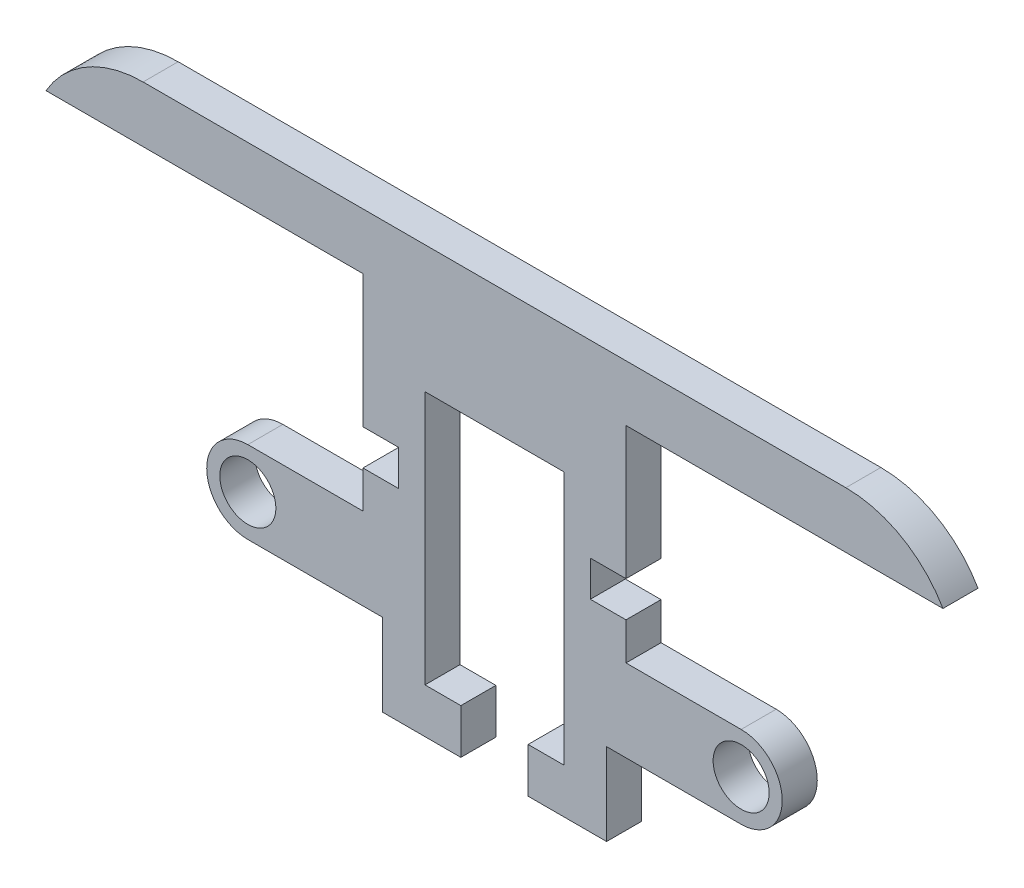
ISO-10303-21;
HEADER;
FILE_DESCRIPTION(('STEP AP214'),'2;1');
FILE_NAME('part.step','',(''),(''),'','','');
FILE_SCHEMA(('AUTOMOTIVE_DESIGN { 1 0 10303 214 1 1 1 1 }'));
ENDSEC;
DATA;
#1=APPLICATION_CONTEXT('core data for automotive mechanical design processes');
#2=APPLICATION_PROTOCOL_DEFINITION('international standard','automotive_design',2000,#1);
#3=PRODUCT_CONTEXT('',#1,'mechanical');
#4=PRODUCT('Part','Part','',(#3));
#5=PRODUCT_RELATED_PRODUCT_CATEGORY('part','',(#4));
#6=PRODUCT_DEFINITION_FORMATION('','',#4);
#7=PRODUCT_DEFINITION_CONTEXT('part definition',#1,'design');
#8=PRODUCT_DEFINITION('design','',#6,#7);
#9=PRODUCT_DEFINITION_SHAPE('','',#8);
#10=(LENGTH_UNIT() NAMED_UNIT(*) SI_UNIT(.MILLI.,.METRE.));
#11=(NAMED_UNIT(*) PLANE_ANGLE_UNIT() SI_UNIT($,.RADIAN.));
#12=(NAMED_UNIT(*) SI_UNIT($,.STERADIAN.) SOLID_ANGLE_UNIT());
#13=UNCERTAINTY_MEASURE_WITH_UNIT(LENGTH_MEASURE(1.E-05),#10,'distance_accuracy_value','');
#14=(GEOMETRIC_REPRESENTATION_CONTEXT(3) GLOBAL_UNCERTAINTY_ASSIGNED_CONTEXT((#13)) GLOBAL_UNIT_ASSIGNED_CONTEXT((#10,
#11,#12)) REPRESENTATION_CONTEXT('',''));
#15=CARTESIAN_POINT('',(0.,0.,0.));
#16=DIRECTION('',(0.,0.,1.));
#17=DIRECTION('',(1.,0.,0.));
#18=AXIS2_PLACEMENT_3D('',#15,#16,#17);
#19=CARTESIAN_POINT('',(22.,-8.00500000000001,3.125));
#20=DIRECTION('',(0.,0.,1.));
#21=DIRECTION('',(1.,0.,0.));
#22=AXIS2_PLACEMENT_3D('',#19,#20,#21);
#23=PLANE('',#22);
#24=DIRECTION('',(-1.,0.,0.));
#25=VECTOR('',#24,1.);
#26=CARTESIAN_POINT('',(0.,19.,3.125));
#27=LINE('',#26,#25);
#28=CARTESIAN_POINT('',(31.3397459621556,19.,3.125));
#29=VERTEX_POINT('',#28);
#30=CARTESIAN_POINT('',(-31.3397459621556,19.,3.125));
#31=VERTEX_POINT('',#30);
#32=EDGE_CURVE('E252',#29,#31,#27,.T.);
#33=ORIENTED_EDGE('',*,*,#32,.T.);
#34=CARTESIAN_POINT('',(-31.3397459621556,9.,3.125));
#35=DIRECTION('',(0.,0.,1.));
#36=DIRECTION('',(1.,0.,0.));
#37=AXIS2_PLACEMENT_3D('',#34,#35,#36);
#38=CIRCLE('',#37,10.);
#39=CARTESIAN_POINT('',(-40.,14.,3.125));
#40=VERTEX_POINT('',#39);
#41=EDGE_CURVE('E11',#31,#40,#38,.T.);
#42=ORIENTED_EDGE('',*,*,#41,.T.);
#43=DIRECTION('',(-1.,0.,0.));
#44=VECTOR('',#43,1.);
#45=CARTESIAN_POINT('',(-40.,14.,3.125));
#46=LINE('',#45,#44);
#47=CARTESIAN_POINT('',(-11.73,14.,3.125));
#48=VERTEX_POINT('',#47);
#49=EDGE_CURVE('E250',#48,#40,#46,.T.);
#50=ORIENTED_EDGE('',*,*,#49,.F.);
#51=DIRECTION('',(0.,1.,0.));
#52=VECTOR('',#51,1.);
#53=CARTESIAN_POINT('',(-11.73,14.,3.125));
#54=LINE('',#53,#52);
#55=CARTESIAN_POINT('',(-11.73,2.16999999999999,3.125));
#56=VERTEX_POINT('',#55);
#57=EDGE_CURVE('E263',#56,#48,#54,.T.);
#58=ORIENTED_EDGE('',*,*,#57,.F.);
#59=DIRECTION('',(-1.,0.,0.));
#60=VECTOR('',#59,1.);
#61=CARTESIAN_POINT('',(-11.73,2.16999999999999,3.125));
#62=LINE('',#61,#60);
#63=CARTESIAN_POINT('',(-8.55,2.16999999999999,3.125));
#64=VERTEX_POINT('',#63);
#65=EDGE_CURVE('E564',#64,#56,#62,.T.);
#66=ORIENTED_EDGE('',*,*,#65,.F.);
#67=DIRECTION('',(0.,1.,0.));
#68=VECTOR('',#67,1.);
#69=CARTESIAN_POINT('',(-8.55,2.16999999999999,3.125));
#70=LINE('',#69,#68);
#71=CARTESIAN_POINT('',(-8.55,-1.01000000000001,3.125));
#72=VERTEX_POINT('',#71);
#73=EDGE_CURVE('E573',#72,#64,#70,.T.);
#74=ORIENTED_EDGE('',*,*,#73,.F.);
#75=DIRECTION('',(1.,0.,0.));
#76=VECTOR('',#75,1.);
#77=CARTESIAN_POINT('',(-8.55,-1.01000000000001,3.125));
#78=LINE('',#77,#76);
#79=CARTESIAN_POINT('',(-11.73,-1.01000000000001,3.125));
#80=VERTEX_POINT('',#79);
#81=EDGE_CURVE('E580',#80,#72,#78,.T.);
#82=ORIENTED_EDGE('',*,*,#81,.F.);
#83=DIRECTION('',(0.,1.,0.));
#84=VECTOR('',#83,1.);
#85=CARTESIAN_POINT('',(-11.73,-1.01000000000001,3.125));
#86=LINE('',#85,#84);
#87=CARTESIAN_POINT('',(-11.73,-4.34000000000001,3.125));
#88=VERTEX_POINT('',#87);
#89=EDGE_CURVE('E586',#88,#80,#86,.T.);
#90=ORIENTED_EDGE('',*,*,#89,.F.);
#91=DIRECTION('',(1.,0.,0.));
#92=VECTOR('',#91,1.);
#93=CARTESIAN_POINT('',(-11.73,-4.34000000000001,3.125));
#94=LINE('',#93,#92);
#95=CARTESIAN_POINT('',(-22.,-4.34000000000001,3.125));
#96=VERTEX_POINT('',#95);
#97=EDGE_CURVE('E590',#96,#88,#94,.T.);
#98=ORIENTED_EDGE('',*,*,#97,.F.);
#99=CARTESIAN_POINT('',(-22.,-8.00500000000001,3.125));
#100=DIRECTION('',(0.,0.,-1.));
#101=DIRECTION('',(-1.,0.,0.));
#102=AXIS2_PLACEMENT_3D('',#99,#100,#101);
#103=CIRCLE('',#102,3.665);
#104=CARTESIAN_POINT('',(-22.,-11.67,3.125));
#105=VERTEX_POINT('',#104);
#106=EDGE_CURVE('E594',#105,#96,#103,.T.);
#107=ORIENTED_EDGE('',*,*,#106,.F.);
#108=DIRECTION('',(-1.,0.,0.));
#109=VECTOR('',#108,1.);
#110=CARTESIAN_POINT('',(-22.,-11.67,3.125));
#111=LINE('',#110,#109);
#112=CARTESIAN_POINT('',(-10.,-11.67,3.125));
#113=VERTEX_POINT('',#112);
#114=EDGE_CURVE('E598',#113,#105,#111,.T.);
#115=ORIENTED_EDGE('',*,*,#114,.F.);
#116=DIRECTION('',(0.,1.,0.));
#117=VECTOR('',#116,1.);
#118=CARTESIAN_POINT('',(-10.,-11.67,3.125));
#119=LINE('',#118,#117);
#120=CARTESIAN_POINT('',(-10.,-19.,3.125));
#121=VERTEX_POINT('',#120);
#122=EDGE_CURVE('E602',#121,#113,#119,.T.);
#123=ORIENTED_EDGE('',*,*,#122,.F.);
#124=DIRECTION('',(-1.,0.,0.));
#125=VECTOR('',#124,1.);
#126=CARTESIAN_POINT('',(-10.,-19.,3.125));
#127=LINE('',#126,#125);
#128=CARTESIAN_POINT('',(-3.,-19.,3.125));
#129=VERTEX_POINT('',#128);
#130=EDGE_CURVE('E606',#129,#121,#127,.T.);
#131=ORIENTED_EDGE('',*,*,#130,.F.);
#132=DIRECTION('',(0.,-1.,0.));
#133=VECTOR('',#132,1.);
#134=CARTESIAN_POINT('',(-3.,-19.,3.125));
#135=LINE('',#134,#133);
#136=CARTESIAN_POINT('',(-3.,-15.,3.125));
#137=VERTEX_POINT('',#136);
#138=EDGE_CURVE('E610',#137,#129,#135,.T.);
#139=ORIENTED_EDGE('',*,*,#138,.F.);
#140=DIRECTION('',(1.,0.,0.));
#141=VECTOR('',#140,1.);
#142=CARTESIAN_POINT('',(-3.,-15.,3.125));
#143=LINE('',#142,#141);
#144=CARTESIAN_POINT('',(-6.2,-15.,3.125));
#145=VERTEX_POINT('',#144);
#146=EDGE_CURVE('E613',#145,#137,#143,.T.);
#147=ORIENTED_EDGE('',*,*,#146,.F.);
#148=DIRECTION('',(0.,-1.,0.));
#149=VECTOR('',#148,1.);
#150=CARTESIAN_POINT('',(-6.2,-15.,3.125));
#151=LINE('',#150,#149);
#152=CARTESIAN_POINT('',(-6.2,7.65,3.125));
#153=VERTEX_POINT('',#152);
#154=EDGE_CURVE('E474',#153,#145,#151,.T.);
#155=ORIENTED_EDGE('',*,*,#154,.F.);
#156=DIRECTION('',(1.,0.,0.));
#157=VECTOR('',#156,1.);
#158=CARTESIAN_POINT('',(6.2,7.65,3.125));
#159=LINE('',#158,#157);
#160=CARTESIAN_POINT('',(6.2,7.65,3.125));
#161=VERTEX_POINT('',#160);
#162=EDGE_CURVE('E284',#153,#161,#159,.T.);
#163=ORIENTED_EDGE('',*,*,#162,.T.);
#164=DIRECTION('',(0.,-1.,0.));
#165=VECTOR('',#164,1.);
#166=CARTESIAN_POINT('',(6.2,-15.,3.125));
#167=LINE('',#166,#165);
#168=CARTESIAN_POINT('',(6.2,-15.,3.125));
#169=VERTEX_POINT('',#168);
#170=EDGE_CURVE('E287',#161,#169,#167,.T.);
#171=ORIENTED_EDGE('',*,*,#170,.T.);
#172=DIRECTION('',(-1.,0.,0.));
#173=VECTOR('',#172,1.);
#174=CARTESIAN_POINT('',(3.,-15.,3.125));
#175=LINE('',#174,#173);
#176=CARTESIAN_POINT('',(3.,-15.,3.125));
#177=VERTEX_POINT('',#176);
#178=EDGE_CURVE('E291',#169,#177,#175,.T.);
#179=ORIENTED_EDGE('',*,*,#178,.T.);
#180=DIRECTION('',(0.,-1.,0.));
#181=VECTOR('',#180,1.);
#182=CARTESIAN_POINT('',(3.,-19.,3.125));
#183=LINE('',#182,#181);
#184=CARTESIAN_POINT('',(3.,-19.,3.125));
#185=VERTEX_POINT('',#184);
#186=EDGE_CURVE('E294',#177,#185,#183,.T.);
#187=ORIENTED_EDGE('',*,*,#186,.T.);
#188=DIRECTION('',(1.,0.,0.));
#189=VECTOR('',#188,1.);
#190=CARTESIAN_POINT('',(10.,-19.,3.125));
#191=LINE('',#190,#189);
#192=CARTESIAN_POINT('',(10.,-19.,3.125));
#193=VERTEX_POINT('',#192);
#194=EDGE_CURVE('E297',#185,#193,#191,.T.);
#195=ORIENTED_EDGE('',*,*,#194,.T.);
#196=DIRECTION('',(0.,1.,0.));
#197=VECTOR('',#196,1.);
#198=CARTESIAN_POINT('',(10.,-11.67,3.125));
#199=LINE('',#198,#197);
#200=CARTESIAN_POINT('',(10.,-11.67,3.125));
#201=VERTEX_POINT('',#200);
#202=EDGE_CURVE('E300',#193,#201,#199,.T.);
#203=ORIENTED_EDGE('',*,*,#202,.T.);
#204=DIRECTION('',(1.,0.,0.));
#205=VECTOR('',#204,1.);
#206=CARTESIAN_POINT('',(22.,-11.67,3.125));
#207=LINE('',#206,#205);
#208=CARTESIAN_POINT('',(22.,-11.67,3.125));
#209=VERTEX_POINT('',#208);
#210=EDGE_CURVE('E303',#201,#209,#207,.T.);
#211=ORIENTED_EDGE('',*,*,#210,.T.);
#212=CARTESIAN_POINT('',(22.,-8.00500000000001,3.125));
#213=DIRECTION('',(0.,0.,1.));
#214=DIRECTION('',(1.,0.,0.));
#215=AXIS2_PLACEMENT_3D('',#212,#213,#214);
#216=CIRCLE('',#215,3.665);
#217=CARTESIAN_POINT('',(22.,-4.34000000000001,3.125));
#218=VERTEX_POINT('',#217);
#219=EDGE_CURVE('E306',#209,#218,#216,.T.);
#220=ORIENTED_EDGE('',*,*,#219,.T.);
#221=DIRECTION('',(-1.,0.,0.));
#222=VECTOR('',#221,1.);
#223=CARTESIAN_POINT('',(11.73,-4.34000000000001,3.125));
#224=LINE('',#223,#222);
#225=CARTESIAN_POINT('',(11.73,-4.34000000000001,3.125));
#226=VERTEX_POINT('',#225);
#227=EDGE_CURVE('E309',#218,#226,#224,.T.);
#228=ORIENTED_EDGE('',*,*,#227,.T.);
#229=DIRECTION('',(0.,1.,0.));
#230=VECTOR('',#229,1.);
#231=CARTESIAN_POINT('',(11.73,-1.01000000000001,3.125));
#232=LINE('',#231,#230);
#233=CARTESIAN_POINT('',(11.73,-1.01000000000001,3.125));
#234=VERTEX_POINT('',#233);
#235=EDGE_CURVE('E312',#226,#234,#232,.T.);
#236=ORIENTED_EDGE('',*,*,#235,.T.);
#237=DIRECTION('',(-1.,0.,0.));
#238=VECTOR('',#237,1.);
#239=CARTESIAN_POINT('',(8.55,-1.01000000000001,3.125));
#240=LINE('',#239,#238);
#241=CARTESIAN_POINT('',(8.55,-1.01000000000001,3.125));
#242=VERTEX_POINT('',#241);
#243=EDGE_CURVE('E315',#234,#242,#240,.T.);
#244=ORIENTED_EDGE('',*,*,#243,.T.);
#245=DIRECTION('',(0.,1.,0.));
#246=VECTOR('',#245,1.);
#247=CARTESIAN_POINT('',(8.55,2.16999999999999,3.125));
#248=LINE('',#247,#246);
#249=CARTESIAN_POINT('',(8.55,2.16999999999999,3.125));
#250=VERTEX_POINT('',#249);
#251=EDGE_CURVE('E318',#242,#250,#248,.T.);
#252=ORIENTED_EDGE('',*,*,#251,.T.);
#253=DIRECTION('',(1.,0.,0.));
#254=VECTOR('',#253,1.);
#255=CARTESIAN_POINT('',(11.73,2.17,3.125));
#256=LINE('',#255,#254);
#257=CARTESIAN_POINT('',(11.73,2.17,3.125));
#258=VERTEX_POINT('',#257);
#259=EDGE_CURVE('E321',#250,#258,#256,.T.);
#260=ORIENTED_EDGE('',*,*,#259,.T.);
#261=DIRECTION('',(0.,1.,0.));
#262=VECTOR('',#261,1.);
#263=CARTESIAN_POINT('',(11.73,14.,3.125));
#264=LINE('',#263,#262);
#265=CARTESIAN_POINT('',(11.73,14.,3.125));
#266=VERTEX_POINT('',#265);
#267=EDGE_CURVE('E324',#258,#266,#264,.T.);
#268=ORIENTED_EDGE('',*,*,#267,.T.);
#269=DIRECTION('',(1.,0.,0.));
#270=VECTOR('',#269,1.);
#271=CARTESIAN_POINT('',(40.,14.,3.125));
#272=LINE('',#271,#270);
#273=CARTESIAN_POINT('',(40.,14.,3.125));
#274=VERTEX_POINT('',#273);
#275=EDGE_CURVE('E327',#266,#274,#272,.T.);
#276=ORIENTED_EDGE('',*,*,#275,.T.);
#277=CARTESIAN_POINT('',(31.3397459621556,9.,3.125));
#278=DIRECTION('',(0.,0.,1.));
#279=DIRECTION('',(1.,0.,0.));
#280=AXIS2_PLACEMENT_3D('',#277,#278,#279);
#281=CIRCLE('',#280,10.);
#282=EDGE_CURVE('E48',#274,#29,#281,.T.);
#283=ORIENTED_EDGE('',*,*,#282,.T.);
#284=EDGE_LOOP('',(#33,#42,#50,#58,#66,#74,#82,#90,#98,#107,#115,#123,#131,#139,#147,#155,#163,
#171,#179,#187,#195,#203,#211,#220,#228,#236,#244,#252,#260,#268,#276,#283));
#285=FACE_BOUND('',#284,.T.);
#286=CARTESIAN_POINT('',(22.,-8.00500000000001,3.125));
#287=DIRECTION('',(0.,0.,1.));
#288=DIRECTION('',(1.,0.,0.));
#289=AXIS2_PLACEMENT_3D('',#286,#287,#288);
#290=CIRCLE('',#289,2.5);
#291=CARTESIAN_POINT('',(24.5,-8.00500000000001,3.125));
#292=VERTEX_POINT('',#291);
#293=EDGE_CURVE('E274',#292,#292,#290,.T.);
#294=ORIENTED_EDGE('',*,*,#293,.F.);
#295=EDGE_LOOP('',(#294));
#296=FACE_BOUND('',#295,.T.);
#297=CARTESIAN_POINT('',(-22.,-8.00500000000001,3.125));
#298=DIRECTION('',(0.,0.,-1.));
#299=DIRECTION('',(-1.,0.,0.));
#300=AXIS2_PLACEMENT_3D('',#297,#298,#299);
#301=CIRCLE('',#300,2.5);
#302=CARTESIAN_POINT('',(-24.5,-8.00500000000002,3.125));
#303=VERTEX_POINT('',#302);
#304=EDGE_CURVE('E464',#303,#303,#301,.T.);
#305=ORIENTED_EDGE('',*,*,#304,.T.);
#306=EDGE_LOOP('',(#305));
#307=FACE_BOUND('',#306,.T.);
#308=ADVANCED_FACE('F39',(#285,#296,#307),#23,.T.);
#309=CARTESIAN_POINT('',(22.,-8.00500000000001,0.));
#310=DIRECTION('',(0.,0.,1.));
#311=DIRECTION('',(1.,0.,0.));
#312=AXIS2_PLACEMENT_3D('',#309,#310,#311);
#313=PLANE('',#312);
#314=DIRECTION('',(-1.,0.,0.));
#315=VECTOR('',#314,1.);
#316=CARTESIAN_POINT('',(-40.,14.,0.));
#317=LINE('',#316,#315);
#318=CARTESIAN_POINT('',(-11.73,14.,0.));
#319=VERTEX_POINT('',#318);
#320=CARTESIAN_POINT('',(-40.,14.,0.));
#321=VERTEX_POINT('',#320);
#322=EDGE_CURVE('E459',#319,#321,#317,.T.);
#323=ORIENTED_EDGE('',*,*,#322,.T.);
#324=CARTESIAN_POINT('',(-31.3397459621556,9.,0.));
#325=DIRECTION('',(0.,0.,1.));
#326=DIRECTION('',(1.,0.,0.));
#327=AXIS2_PLACEMENT_3D('',#324,#325,#326);
#328=CIRCLE('',#327,10.);
#329=CARTESIAN_POINT('',(-31.3397459621556,19.,0.));
#330=VERTEX_POINT('',#329);
#331=EDGE_CURVE('E267',#321,#330,#328,.F.);
#332=ORIENTED_EDGE('',*,*,#331,.T.);
#333=DIRECTION('',(-1.,0.,0.));
#334=VECTOR('',#333,1.);
#335=CARTESIAN_POINT('',(0.,19.,0.));
#336=LINE('',#335,#334);
#337=CARTESIAN_POINT('',(31.3397459621556,19.,0.));
#338=VERTEX_POINT('',#337);
#339=EDGE_CURVE('E288',#338,#330,#336,.T.);
#340=ORIENTED_EDGE('',*,*,#339,.F.);
#341=CARTESIAN_POINT('',(31.3397459621556,9.,0.));
#342=DIRECTION('',(0.,0.,1.));
#343=DIRECTION('',(1.,0.,0.));
#344=AXIS2_PLACEMENT_3D('',#341,#342,#343);
#345=CIRCLE('',#344,10.);
#346=CARTESIAN_POINT('',(40.,14.,0.));
#347=VERTEX_POINT('',#346);
#348=EDGE_CURVE('E439',#338,#347,#345,.F.);
#349=ORIENTED_EDGE('',*,*,#348,.T.);
#350=DIRECTION('',(1.,0.,0.));
#351=VECTOR('',#350,1.);
#352=CARTESIAN_POINT('',(40.,14.,0.));
#353=LINE('',#352,#351);
#354=CARTESIAN_POINT('',(11.73,14.,0.));
#355=VERTEX_POINT('',#354);
#356=EDGE_CURVE('E374',#355,#347,#353,.T.);
#357=ORIENTED_EDGE('',*,*,#356,.F.);
#358=DIRECTION('',(0.,1.,0.));
#359=VECTOR('',#358,1.);
#360=CARTESIAN_POINT('',(11.73,14.,0.));
#361=LINE('',#360,#359);
#362=CARTESIAN_POINT('',(11.73,2.17,0.));
#363=VERTEX_POINT('',#362);
#364=EDGE_CURVE('E371',#363,#355,#361,.T.);
#365=ORIENTED_EDGE('',*,*,#364,.F.);
#366=DIRECTION('',(1.,0.,0.));
#367=VECTOR('',#366,1.);
#368=CARTESIAN_POINT('',(11.73,2.17,0.));
#369=LINE('',#368,#367);
#370=CARTESIAN_POINT('',(8.55,2.16999999999999,0.));
#371=VERTEX_POINT('',#370);
#372=EDGE_CURVE('E368',#371,#363,#369,.T.);
#373=ORIENTED_EDGE('',*,*,#372,.F.);
#374=DIRECTION('',(0.,1.,0.));
#375=VECTOR('',#374,1.);
#376=CARTESIAN_POINT('',(8.55,2.16999999999999,0.));
#377=LINE('',#376,#375);
#378=CARTESIAN_POINT('',(8.55,-1.01000000000001,0.));
#379=VERTEX_POINT('',#378);
#380=EDGE_CURVE('E365',#379,#371,#377,.T.);
#381=ORIENTED_EDGE('',*,*,#380,.F.);
#382=DIRECTION('',(-1.,0.,0.));
#383=VECTOR('',#382,1.);
#384=CARTESIAN_POINT('',(8.55,-1.01000000000001,0.));
#385=LINE('',#384,#383);
#386=CARTESIAN_POINT('',(11.73,-1.01000000000001,0.));
#387=VERTEX_POINT('',#386);
#388=EDGE_CURVE('E362',#387,#379,#385,.T.);
#389=ORIENTED_EDGE('',*,*,#388,.F.);
#390=DIRECTION('',(0.,1.,0.));
#391=VECTOR('',#390,1.);
#392=CARTESIAN_POINT('',(11.73,-1.01000000000001,0.));
#393=LINE('',#392,#391);
#394=CARTESIAN_POINT('',(11.73,-4.34000000000001,0.));
#395=VERTEX_POINT('',#394);
#396=EDGE_CURVE('E359',#395,#387,#393,.T.);
#397=ORIENTED_EDGE('',*,*,#396,.F.);
#398=DIRECTION('',(-1.,0.,0.));
#399=VECTOR('',#398,1.);
#400=CARTESIAN_POINT('',(11.73,-4.34000000000001,0.));
#401=LINE('',#400,#399);
#402=CARTESIAN_POINT('',(22.,-4.34000000000001,0.));
#403=VERTEX_POINT('',#402);
#404=EDGE_CURVE('E356',#403,#395,#401,.T.);
#405=ORIENTED_EDGE('',*,*,#404,.F.);
#406=CARTESIAN_POINT('',(22.,-8.00500000000001,0.));
#407=DIRECTION('',(0.,0.,1.));
#408=DIRECTION('',(1.,0.,0.));
#409=AXIS2_PLACEMENT_3D('',#406,#407,#408);
#410=CIRCLE('',#409,3.665);
#411=CARTESIAN_POINT('',(22.,-11.67,0.));
#412=VERTEX_POINT('',#411);
#413=EDGE_CURVE('E353',#412,#403,#410,.T.);
#414=ORIENTED_EDGE('',*,*,#413,.F.);
#415=DIRECTION('',(1.,0.,0.));
#416=VECTOR('',#415,1.);
#417=CARTESIAN_POINT('',(22.,-11.67,0.));
#418=LINE('',#417,#416);
#419=CARTESIAN_POINT('',(10.,-11.67,0.));
#420=VERTEX_POINT('',#419);
#421=EDGE_CURVE('E350',#420,#412,#418,.T.);
#422=ORIENTED_EDGE('',*,*,#421,.F.);
#423=DIRECTION('',(0.,1.,0.));
#424=VECTOR('',#423,1.);
#425=CARTESIAN_POINT('',(10.,-11.67,0.));
#426=LINE('',#425,#424);
#427=CARTESIAN_POINT('',(10.,-19.,0.));
#428=VERTEX_POINT('',#427);
#429=EDGE_CURVE('E347',#428,#420,#426,.T.);
#430=ORIENTED_EDGE('',*,*,#429,.F.);
#431=DIRECTION('',(1.,0.,0.));
#432=VECTOR('',#431,1.);
#433=CARTESIAN_POINT('',(10.,-19.,0.));
#434=LINE('',#433,#432);
#435=CARTESIAN_POINT('',(3.,-19.,0.));
#436=VERTEX_POINT('',#435);
#437=EDGE_CURVE('E344',#436,#428,#434,.T.);
#438=ORIENTED_EDGE('',*,*,#437,.F.);
#439=DIRECTION('',(0.,-1.,0.));
#440=VECTOR('',#439,1.);
#441=CARTESIAN_POINT('',(3.,-19.,0.));
#442=LINE('',#441,#440);
#443=CARTESIAN_POINT('',(3.,-15.,0.));
#444=VERTEX_POINT('',#443);
#445=EDGE_CURVE('E341',#444,#436,#442,.T.);
#446=ORIENTED_EDGE('',*,*,#445,.F.);
#447=DIRECTION('',(-1.,0.,0.));
#448=VECTOR('',#447,1.);
#449=CARTESIAN_POINT('',(3.,-15.,0.));
#450=LINE('',#449,#448);
#451=CARTESIAN_POINT('',(6.2,-15.,0.));
#452=VERTEX_POINT('',#451);
#453=EDGE_CURVE('E338',#452,#444,#450,.T.);
#454=ORIENTED_EDGE('',*,*,#453,.F.);
#455=DIRECTION('',(0.,-1.,0.));
#456=VECTOR('',#455,1.);
#457=CARTESIAN_POINT('',(6.2,-15.,0.));
#458=LINE('',#457,#456);
#459=CARTESIAN_POINT('',(6.2,7.65,0.));
#460=VERTEX_POINT('',#459);
#461=EDGE_CURVE('E335',#460,#452,#458,.T.);
#462=ORIENTED_EDGE('',*,*,#461,.F.);
#463=DIRECTION('',(1.,0.,0.));
#464=VECTOR('',#463,1.);
#465=CARTESIAN_POINT('',(6.2,7.65,0.));
#466=LINE('',#465,#464);
#467=CARTESIAN_POINT('',(-6.2,7.65,0.));
#468=VERTEX_POINT('',#467);
#469=EDGE_CURVE('E282',#468,#460,#466,.T.);
#470=ORIENTED_EDGE('',*,*,#469,.F.);
#471=DIRECTION('',(0.,-1.,0.));
#472=VECTOR('',#471,1.);
#473=CARTESIAN_POINT('',(-6.2,-15.,0.));
#474=LINE('',#473,#472);
#475=CARTESIAN_POINT('',(-6.2,-15.,0.));
#476=VERTEX_POINT('',#475);
#477=EDGE_CURVE('E264',#468,#476,#474,.T.);
#478=ORIENTED_EDGE('',*,*,#477,.T.);
#479=DIRECTION('',(1.,0.,0.));
#480=VECTOR('',#479,1.);
#481=CARTESIAN_POINT('',(-3.,-15.,0.));
#482=LINE('',#481,#480);
#483=CARTESIAN_POINT('',(-3.,-15.,0.));
#484=VERTEX_POINT('',#483);
#485=EDGE_CURVE('E515',#476,#484,#482,.T.);
#486=ORIENTED_EDGE('',*,*,#485,.T.);
#487=DIRECTION('',(0.,-1.,0.));
#488=VECTOR('',#487,1.);
#489=CARTESIAN_POINT('',(-3.,-19.,0.));
#490=LINE('',#489,#488);
#491=CARTESIAN_POINT('',(-3.,-19.,0.));
#492=VERTEX_POINT('',#491);
#493=EDGE_CURVE('E511',#484,#492,#490,.T.);
#494=ORIENTED_EDGE('',*,*,#493,.T.);
#495=DIRECTION('',(-1.,0.,0.));
#496=VECTOR('',#495,1.);
#497=CARTESIAN_POINT('',(-10.,-19.,0.));
#498=LINE('',#497,#496);
#499=CARTESIAN_POINT('',(-10.,-19.,0.));
#500=VERTEX_POINT('',#499);
#501=EDGE_CURVE('E507',#492,#500,#498,.T.);
#502=ORIENTED_EDGE('',*,*,#501,.T.);
#503=DIRECTION('',(0.,1.,0.));
#504=VECTOR('',#503,1.);
#505=CARTESIAN_POINT('',(-10.,-11.67,0.));
#506=LINE('',#505,#504);
#507=CARTESIAN_POINT('',(-10.,-11.67,0.));
#508=VERTEX_POINT('',#507);
#509=EDGE_CURVE('E503',#500,#508,#506,.T.);
#510=ORIENTED_EDGE('',*,*,#509,.T.);
#511=DIRECTION('',(-1.,0.,0.));
#512=VECTOR('',#511,1.);
#513=CARTESIAN_POINT('',(-22.,-11.67,0.));
#514=LINE('',#513,#512);
#515=CARTESIAN_POINT('',(-22.,-11.67,0.));
#516=VERTEX_POINT('',#515);
#517=EDGE_CURVE('E499',#508,#516,#514,.T.);
#518=ORIENTED_EDGE('',*,*,#517,.T.);
#519=CARTESIAN_POINT('',(-22.,-8.00500000000001,0.));
#520=DIRECTION('',(0.,0.,-1.));
#521=DIRECTION('',(-1.,0.,0.));
#522=AXIS2_PLACEMENT_3D('',#519,#520,#521);
#523=CIRCLE('',#522,3.665);
#524=CARTESIAN_POINT('',(-22.,-4.34000000000001,0.));
#525=VERTEX_POINT('',#524);
#526=EDGE_CURVE('E495',#516,#525,#523,.T.);
#527=ORIENTED_EDGE('',*,*,#526,.T.);
#528=DIRECTION('',(1.,0.,0.));
#529=VECTOR('',#528,1.);
#530=CARTESIAN_POINT('',(-11.73,-4.34000000000001,0.));
#531=LINE('',#530,#529);
#532=CARTESIAN_POINT('',(-11.73,-4.34000000000001,0.));
#533=VERTEX_POINT('',#532);
#534=EDGE_CURVE('E491',#525,#533,#531,.T.);
#535=ORIENTED_EDGE('',*,*,#534,.T.);
#536=DIRECTION('',(0.,1.,0.));
#537=VECTOR('',#536,1.);
#538=CARTESIAN_POINT('',(-11.73,-1.01000000000001,0.));
#539=LINE('',#538,#537);
#540=CARTESIAN_POINT('',(-11.73,-1.01000000000001,0.));
#541=VERTEX_POINT('',#540);
#542=EDGE_CURVE('E487',#533,#541,#539,.T.);
#543=ORIENTED_EDGE('',*,*,#542,.T.);
#544=DIRECTION('',(1.,0.,0.));
#545=VECTOR('',#544,1.);
#546=CARTESIAN_POINT('',(-8.55,-1.01000000000001,0.));
#547=LINE('',#546,#545);
#548=CARTESIAN_POINT('',(-8.55,-1.01000000000001,0.));
#549=VERTEX_POINT('',#548);
#550=EDGE_CURVE('E483',#541,#549,#547,.T.);
#551=ORIENTED_EDGE('',*,*,#550,.T.);
#552=DIRECTION('',(0.,1.,0.));
#553=VECTOR('',#552,1.);
#554=CARTESIAN_POINT('',(-8.55,2.16999999999999,0.));
#555=LINE('',#554,#553);
#556=CARTESIAN_POINT('',(-8.55,2.16999999999999,0.));
#557=VERTEX_POINT('',#556);
#558=EDGE_CURVE('E479',#549,#557,#555,.T.);
#559=ORIENTED_EDGE('',*,*,#558,.T.);
#560=DIRECTION('',(-1.,0.,0.));
#561=VECTOR('',#560,1.);
#562=CARTESIAN_POINT('',(-11.73,2.16999999999999,0.));
#563=LINE('',#562,#561);
#564=CARTESIAN_POINT('',(-11.73,2.16999999999999,0.));
#565=VERTEX_POINT('',#564);
#566=EDGE_CURVE('E468',#557,#565,#563,.T.);
#567=ORIENTED_EDGE('',*,*,#566,.T.);
#568=DIRECTION('',(0.,1.,0.));
#569=VECTOR('',#568,1.);
#570=CARTESIAN_POINT('',(-11.73,14.,0.));
#571=LINE('',#570,#569);
#572=EDGE_CURVE('E462',#565,#319,#571,.T.);
#573=ORIENTED_EDGE('',*,*,#572,.T.);
#574=EDGE_LOOP('',(#323,#332,#340,#349,#357,#365,#373,#381,#389,#397,#405,#414,#422,#430,#438,
#446,#454,#462,#470,#478,#486,#494,#502,#510,#518,#527,#535,#543,#551,#559,#567,#573));
#575=FACE_BOUND('',#574,.T.);
#576=CARTESIAN_POINT('',(22.,-8.00500000000001,0.));
#577=DIRECTION('',(0.,0.,1.));
#578=DIRECTION('',(1.,0.,0.));
#579=AXIS2_PLACEMENT_3D('',#576,#577,#578);
#580=CIRCLE('',#579,2.5);
#581=CARTESIAN_POINT('',(24.5,-8.00500000000001,0.));
#582=VERTEX_POINT('',#581);
#583=EDGE_CURVE('E269',#582,#582,#580,.T.);
#584=ORIENTED_EDGE('',*,*,#583,.T.);
#585=EDGE_LOOP('',(#584));
#586=FACE_BOUND('',#585,.T.);
#587=CARTESIAN_POINT('',(-22.,-8.00500000000001,0.));
#588=DIRECTION('',(0.,0.,-1.));
#589=DIRECTION('',(-1.,0.,0.));
#590=AXIS2_PLACEMENT_3D('',#587,#588,#589);
#591=CIRCLE('',#590,2.5);
#592=CARTESIAN_POINT('',(-24.5,-8.00500000000002,0.));
#593=VERTEX_POINT('',#592);
#594=EDGE_CURVE('E471',#593,#593,#591,.T.);
#595=ORIENTED_EDGE('',*,*,#594,.F.);
#596=EDGE_LOOP('',(#595));
#597=FACE_BOUND('',#596,.T.);
#598=ADVANCED_FACE('F455',(#575,#586,#597),#313,.F.);
#599=CARTESIAN_POINT('',(6.2,7.65,3.125));
#600=DIRECTION('',(0.,1.,0.));
#601=DIRECTION('',(-1.,0.,0.));
#602=AXIS2_PLACEMENT_3D('',#599,#600,#601);
#603=PLANE('',#602);
#604=ORIENTED_EDGE('',*,*,#469,.T.);
#605=DIRECTION('',(0.,0.,-1.));
#606=VECTOR('',#605,1.);
#607=CARTESIAN_POINT('',(6.2,7.65,3.125));
#608=LINE('',#607,#606);
#609=EDGE_CURVE('E435',#161,#460,#608,.T.);
#610=ORIENTED_EDGE('',*,*,#609,.F.);
#611=ORIENTED_EDGE('',*,*,#162,.F.);
#612=DIRECTION('',(0.,0.,-1.));
#613=VECTOR('',#612,1.);
#614=CARTESIAN_POINT('',(-6.2,7.65,3.125));
#615=LINE('',#614,#613);
#616=EDGE_CURVE('E522',#153,#468,#615,.T.);
#617=ORIENTED_EDGE('',*,*,#616,.T.);
#618=EDGE_LOOP('',(#604,#610,#611,#617));
#619=FACE_BOUND('',#618,.T.);
#620=ADVANCED_FACE('F638',(#619),#603,.F.);
#621=CARTESIAN_POINT('',(6.2,-15.,3.125));
#622=DIRECTION('',(1.,0.,0.));
#623=DIRECTION('',(0.,0.,-1.));
#624=AXIS2_PLACEMENT_3D('',#621,#622,#623);
#625=PLANE('',#624);
#626=ORIENTED_EDGE('',*,*,#461,.T.);
#627=DIRECTION('',(0.,0.,-1.));
#628=VECTOR('',#627,1.);
#629=CARTESIAN_POINT('',(6.2,-15.,3.125));
#630=LINE('',#629,#628);
#631=EDGE_CURVE('E431',#169,#452,#630,.T.);
#632=ORIENTED_EDGE('',*,*,#631,.F.);
#633=ORIENTED_EDGE('',*,*,#170,.F.);
#634=ORIENTED_EDGE('',*,*,#609,.T.);
#635=EDGE_LOOP('',(#626,#632,#633,#634));
#636=FACE_BOUND('',#635,.T.);
#637=ADVANCED_FACE('F642',(#636),#625,.F.);
#638=CARTESIAN_POINT('',(3.,-15.,3.125));
#639=DIRECTION('',(0.,-1.,0.));
#640=DIRECTION('',(0.,0.,-1.));
#641=AXIS2_PLACEMENT_3D('',#638,#639,#640);
#642=PLANE('',#641);
#643=ORIENTED_EDGE('',*,*,#453,.T.);
#644=DIRECTION('',(0.,0.,-1.));
#645=VECTOR('',#644,1.);
#646=CARTESIAN_POINT('',(3.,-15.,3.125));
#647=LINE('',#646,#645);
#648=EDGE_CURVE('E427',#177,#444,#647,.T.);
#649=ORIENTED_EDGE('',*,*,#648,.F.);
#650=ORIENTED_EDGE('',*,*,#178,.F.);
#651=ORIENTED_EDGE('',*,*,#631,.T.);
#652=EDGE_LOOP('',(#643,#649,#650,#651));
#653=FACE_BOUND('',#652,.T.);
#654=ADVANCED_FACE('F648',(#653),#642,.F.);
#655=CARTESIAN_POINT('',(3.,-19.,3.125));
#656=DIRECTION('',(1.,0.,0.));
#657=DIRECTION('',(0.,0.,-1.));
#658=AXIS2_PLACEMENT_3D('',#655,#656,#657);
#659=PLANE('',#658);
#660=ORIENTED_EDGE('',*,*,#445,.T.);
#661=DIRECTION('',(0.,0.,-1.));
#662=VECTOR('',#661,1.);
#663=CARTESIAN_POINT('',(3.,-19.,3.125));
#664=LINE('',#663,#662);
#665=EDGE_CURVE('E423',#185,#436,#664,.T.);
#666=ORIENTED_EDGE('',*,*,#665,.F.);
#667=ORIENTED_EDGE('',*,*,#186,.F.);
#668=ORIENTED_EDGE('',*,*,#648,.T.);
#669=EDGE_LOOP('',(#660,#666,#667,#668));
#670=FACE_BOUND('',#669,.T.);
#671=ADVANCED_FACE('F651',(#670),#659,.F.);
#672=CARTESIAN_POINT('',(10.,-19.,3.125));
#673=DIRECTION('',(0.,1.,0.));
#674=DIRECTION('',(0.,0.,1.));
#675=AXIS2_PLACEMENT_3D('',#672,#673,#674);
#676=PLANE('',#675);
#677=ORIENTED_EDGE('',*,*,#437,.T.);
#678=DIRECTION('',(0.,0.,-1.));
#679=VECTOR('',#678,1.);
#680=CARTESIAN_POINT('',(10.,-19.,3.125));
#681=LINE('',#680,#679);
#682=EDGE_CURVE('E419',#193,#428,#681,.T.);
#683=ORIENTED_EDGE('',*,*,#682,.F.);
#684=ORIENTED_EDGE('',*,*,#194,.F.);
#685=ORIENTED_EDGE('',*,*,#665,.T.);
#686=EDGE_LOOP('',(#677,#683,#684,#685));
#687=FACE_BOUND('',#686,.T.);
#688=ADVANCED_FACE('F656',(#687),#676,.F.);
#689=CARTESIAN_POINT('',(10.,-11.67,3.125));
#690=DIRECTION('',(-1.,0.,0.));
#691=DIRECTION('',(0.,0.,1.));
#692=AXIS2_PLACEMENT_3D('',#689,#690,#691);
#693=PLANE('',#692);
#694=ORIENTED_EDGE('',*,*,#429,.T.);
#695=DIRECTION('',(0.,0.,-1.));
#696=VECTOR('',#695,1.);
#697=CARTESIAN_POINT('',(10.,-11.67,3.125));
#698=LINE('',#697,#696);
#699=EDGE_CURVE('E415',#201,#420,#698,.T.);
#700=ORIENTED_EDGE('',*,*,#699,.F.);
#701=ORIENTED_EDGE('',*,*,#202,.F.);
#702=ORIENTED_EDGE('',*,*,#682,.T.);
#703=EDGE_LOOP('',(#694,#700,#701,#702));
#704=FACE_BOUND('',#703,.T.);
#705=ADVANCED_FACE('F662',(#704),#693,.F.);
#706=CARTESIAN_POINT('',(22.,-11.67,3.125));
#707=DIRECTION('',(0.,1.,0.));
#708=DIRECTION('',(0.,0.,1.));
#709=AXIS2_PLACEMENT_3D('',#706,#707,#708);
#710=PLANE('',#709);
#711=ORIENTED_EDGE('',*,*,#421,.T.);
#712=DIRECTION('',(0.,0.,-1.));
#713=VECTOR('',#712,1.);
#714=CARTESIAN_POINT('',(22.,-11.67,3.125));
#715=LINE('',#714,#713);
#716=EDGE_CURVE('E411',#209,#412,#715,.T.);
#717=ORIENTED_EDGE('',*,*,#716,.F.);
#718=ORIENTED_EDGE('',*,*,#210,.F.);
#719=ORIENTED_EDGE('',*,*,#699,.T.);
#720=EDGE_LOOP('',(#711,#717,#718,#719));
#721=FACE_BOUND('',#720,.T.);
#722=ADVANCED_FACE('F666',(#721),#710,.F.);
#723=CARTESIAN_POINT('',(22.,-8.00500000000001,3.125));
#724=DIRECTION('',(0.,0.,-1.));
#725=DIRECTION('',(-1.,0.,0.));
#726=AXIS2_PLACEMENT_3D('',#723,#724,#725);
#727=CYLINDRICAL_SURFACE('',#726,3.665);
#728=ORIENTED_EDGE('',*,*,#413,.T.);
#729=DIRECTION('',(0.,0.,-1.));
#730=VECTOR('',#729,1.);
#731=CARTESIAN_POINT('',(22.,-4.34000000000001,3.125));
#732=LINE('',#731,#730);
#733=EDGE_CURVE('E407',#218,#403,#732,.T.);
#734=ORIENTED_EDGE('',*,*,#733,.F.);
#735=ORIENTED_EDGE('',*,*,#219,.F.);
#736=ORIENTED_EDGE('',*,*,#716,.T.);
#737=EDGE_LOOP('',(#728,#734,#735,#736));
#738=FACE_BOUND('',#737,.T.);
#739=ADVANCED_FACE('F671',(#738),#727,.T.);
#740=CARTESIAN_POINT('',(11.73,-4.34000000000001,3.125));
#741=DIRECTION('',(0.,-1.,0.));
#742=DIRECTION('',(1.,0.,0.));
#743=AXIS2_PLACEMENT_3D('',#740,#741,#742);
#744=PLANE('',#743);
#745=ORIENTED_EDGE('',*,*,#404,.T.);
#746=DIRECTION('',(0.,0.,-1.));
#747=VECTOR('',#746,1.);
#748=CARTESIAN_POINT('',(11.73,-4.34000000000001,3.125));
#749=LINE('',#748,#747);
#750=EDGE_CURVE('E403',#226,#395,#749,.T.);
#751=ORIENTED_EDGE('',*,*,#750,.F.);
#752=ORIENTED_EDGE('',*,*,#227,.F.);
#753=ORIENTED_EDGE('',*,*,#733,.T.);
#754=EDGE_LOOP('',(#745,#751,#752,#753));
#755=FACE_BOUND('',#754,.T.);
#756=ADVANCED_FACE('F677',(#755),#744,.F.);
#757=CARTESIAN_POINT('',(11.73,-1.01000000000001,3.125));
#758=DIRECTION('',(-1.,0.,0.));
#759=DIRECTION('',(0.,0.,1.));
#760=AXIS2_PLACEMENT_3D('',#757,#758,#759);
#761=PLANE('',#760);
#762=ORIENTED_EDGE('',*,*,#396,.T.);
#763=DIRECTION('',(0.,0.,-1.));
#764=VECTOR('',#763,1.);
#765=CARTESIAN_POINT('',(11.73,-1.01000000000001,3.125));
#766=LINE('',#765,#764);
#767=EDGE_CURVE('E399',#234,#387,#766,.T.);
#768=ORIENTED_EDGE('',*,*,#767,.F.);
#769=ORIENTED_EDGE('',*,*,#235,.F.);
#770=ORIENTED_EDGE('',*,*,#750,.T.);
#771=EDGE_LOOP('',(#762,#768,#769,#770));
#772=FACE_BOUND('',#771,.T.);
#773=ADVANCED_FACE('F681',(#772),#761,.F.);
#774=CARTESIAN_POINT('',(8.55,-1.01000000000001,3.125));
#775=DIRECTION('',(0.,-1.,0.));
#776=DIRECTION('',(1.,0.,0.));
#777=AXIS2_PLACEMENT_3D('',#774,#775,#776);
#778=PLANE('',#777);
#779=ORIENTED_EDGE('',*,*,#388,.T.);
#780=DIRECTION('',(0.,0.,-1.));
#781=VECTOR('',#780,1.);
#782=CARTESIAN_POINT('',(8.55,-1.01000000000001,3.125));
#783=LINE('',#782,#781);
#784=EDGE_CURVE('E395',#242,#379,#783,.T.);
#785=ORIENTED_EDGE('',*,*,#784,.F.);
#786=ORIENTED_EDGE('',*,*,#243,.F.);
#787=ORIENTED_EDGE('',*,*,#767,.T.);
#788=EDGE_LOOP('',(#779,#785,#786,#787));
#789=FACE_BOUND('',#788,.T.);
#790=ADVANCED_FACE('F686',(#789),#778,.F.);
#791=CARTESIAN_POINT('',(8.55,2.16999999999999,3.125));
#792=DIRECTION('',(-1.,0.,0.));
#793=DIRECTION('',(0.,0.,1.));
#794=AXIS2_PLACEMENT_3D('',#791,#792,#793);
#795=PLANE('',#794);
#796=ORIENTED_EDGE('',*,*,#380,.T.);
#797=DIRECTION('',(0.,0.,-1.));
#798=VECTOR('',#797,1.);
#799=CARTESIAN_POINT('',(8.55,2.16999999999999,3.125));
#800=LINE('',#799,#798);
#801=EDGE_CURVE('E391',#250,#371,#800,.T.);
#802=ORIENTED_EDGE('',*,*,#801,.F.);
#803=ORIENTED_EDGE('',*,*,#251,.F.);
#804=ORIENTED_EDGE('',*,*,#784,.T.);
#805=EDGE_LOOP('',(#796,#802,#803,#804));
#806=FACE_BOUND('',#805,.T.);
#807=ADVANCED_FACE('F692',(#806),#795,.F.);
#808=CARTESIAN_POINT('',(11.73,2.17,3.125));
#809=DIRECTION('',(0.,1.,0.));
#810=DIRECTION('',(-1.,0.,0.));
#811=AXIS2_PLACEMENT_3D('',#808,#809,#810);
#812=PLANE('',#811);
#813=ORIENTED_EDGE('',*,*,#372,.T.);
#814=DIRECTION('',(0.,0.,-1.));
#815=VECTOR('',#814,1.);
#816=CARTESIAN_POINT('',(11.73,2.17,3.125));
#817=LINE('',#816,#815);
#818=EDGE_CURVE('E387',#258,#363,#817,.T.);
#819=ORIENTED_EDGE('',*,*,#818,.F.);
#820=ORIENTED_EDGE('',*,*,#259,.F.);
#821=ORIENTED_EDGE('',*,*,#801,.T.);
#822=EDGE_LOOP('',(#813,#819,#820,#821));
#823=FACE_BOUND('',#822,.T.);
#824=ADVANCED_FACE('F696',(#823),#812,.F.);
#825=CARTESIAN_POINT('',(11.73,14.,3.125));
#826=DIRECTION('',(-1.,0.,0.));
#827=DIRECTION('',(0.,-1.,0.));
#828=AXIS2_PLACEMENT_3D('',#825,#826,#827);
#829=PLANE('',#828);
#830=ORIENTED_EDGE('',*,*,#364,.T.);
#831=DIRECTION('',(0.,0.,-1.));
#832=VECTOR('',#831,1.);
#833=CARTESIAN_POINT('',(11.73,14.,3.125));
#834=LINE('',#833,#832);
#835=EDGE_CURVE('E383',#266,#355,#834,.T.);
#836=ORIENTED_EDGE('',*,*,#835,.F.);
#837=ORIENTED_EDGE('',*,*,#267,.F.);
#838=ORIENTED_EDGE('',*,*,#818,.T.);
#839=EDGE_LOOP('',(#830,#836,#837,#838));
#840=FACE_BOUND('',#839,.T.);
#841=ADVANCED_FACE('F701',(#840),#829,.F.);
#842=CARTESIAN_POINT('',(40.,14.,3.125));
#843=DIRECTION('',(0.,1.,0.));
#844=DIRECTION('',(-1.,0.,0.));
#845=AXIS2_PLACEMENT_3D('',#842,#843,#844);
#846=PLANE('',#845);
#847=ORIENTED_EDGE('',*,*,#356,.T.);
#848=DIRECTION('',(0.,0.,-1.));
#849=VECTOR('',#848,1.);
#850=CARTESIAN_POINT('',(40.,14.,3.125));
#851=LINE('',#850,#849);
#852=EDGE_CURVE('E332',#274,#347,#851,.T.);
#853=ORIENTED_EDGE('',*,*,#852,.F.);
#854=ORIENTED_EDGE('',*,*,#275,.F.);
#855=ORIENTED_EDGE('',*,*,#835,.T.);
#856=EDGE_LOOP('',(#847,#853,#854,#855));
#857=FACE_BOUND('',#856,.T.);
#858=ADVANCED_FACE('F705',(#857),#846,.F.);
#859=CARTESIAN_POINT('',(0.,19.,3.125));
#860=DIRECTION('',(0.,-1.,0.));
#861=DIRECTION('',(0.,0.,-1.));
#862=AXIS2_PLACEMENT_3D('',#859,#860,#861);
#863=PLANE('',#862);
#864=ORIENTED_EDGE('',*,*,#339,.T.);
#865=DIRECTION('',(0.,0.,1.));
#866=VECTOR('',#865,1.);
#867=CARTESIAN_POINT('',(-31.3397459621556,19.,3.125));
#868=LINE('',#867,#866);
#869=EDGE_CURVE('E55',#330,#31,#868,.T.);
#870=ORIENTED_EDGE('',*,*,#869,.T.);
#871=ORIENTED_EDGE('',*,*,#32,.F.);
#872=DIRECTION('',(0.,0.,-1.));
#873=VECTOR('',#872,1.);
#874=CARTESIAN_POINT('',(31.3397459621556,19.,3.125));
#875=LINE('',#874,#873);
#876=EDGE_CURVE('E444',#29,#338,#875,.T.);
#877=ORIENTED_EDGE('',*,*,#876,.T.);
#878=EDGE_LOOP('',(#864,#870,#871,#877));
#879=FACE_BOUND('',#878,.T.);
#880=ADVANCED_FACE('F452',(#879),#863,.F.);
#881=CARTESIAN_POINT('',(22.,-8.00500000000001,3.125));
#882=DIRECTION('',(0.,0.,-1.));
#883=DIRECTION('',(-1.,0.,0.));
#884=AXIS2_PLACEMENT_3D('',#881,#882,#883);
#885=CYLINDRICAL_SURFACE('',#884,2.5);
#886=ORIENTED_EDGE('',*,*,#293,.T.);
#887=EDGE_LOOP('',(#886));
#888=FACE_BOUND('',#887,.T.);
#889=ORIENTED_EDGE('',*,*,#583,.F.);
#890=EDGE_LOOP('',(#889));
#891=FACE_BOUND('',#890,.T.);
#892=ADVANCED_FACE('F718',(#888,#891),#885,.F.);
#893=CARTESIAN_POINT('',(-40.,14.,3.125));
#894=DIRECTION('',(0.,-1.,0.));
#895=DIRECTION('',(1.,0.,0.));
#896=AXIS2_PLACEMENT_3D('',#893,#894,#895);
#897=PLANE('',#896);
#898=ORIENTED_EDGE('',*,*,#322,.F.);
#899=DIRECTION('',(0.,0.,-1.));
#900=VECTOR('',#899,1.);
#901=CARTESIAN_POINT('',(-11.73,14.,3.125));
#902=LINE('',#901,#900);
#903=EDGE_CURVE('E261',#48,#319,#902,.T.);
#904=ORIENTED_EDGE('',*,*,#903,.F.);
#905=ORIENTED_EDGE('',*,*,#49,.T.);
#906=DIRECTION('',(0.,0.,-1.));
#907=VECTOR('',#906,1.);
#908=CARTESIAN_POINT('',(-40.,14.,3.125));
#909=LINE('',#908,#907);
#910=EDGE_CURVE('E259',#40,#321,#909,.T.);
#911=ORIENTED_EDGE('',*,*,#910,.T.);
#912=EDGE_LOOP('',(#898,#904,#905,#911));
#913=FACE_BOUND('',#912,.T.);
#914=ADVANCED_FACE('F258',(#913),#897,.T.);
#915=CARTESIAN_POINT('',(-11.73,14.,3.125));
#916=DIRECTION('',(-1.,0.,0.));
#917=DIRECTION('',(0.,-1.,0.));
#918=AXIS2_PLACEMENT_3D('',#915,#916,#917);
#919=PLANE('',#918);
#920=ORIENTED_EDGE('',*,*,#572,.F.);
#921=DIRECTION('',(0.,0.,-1.));
#922=VECTOR('',#921,1.);
#923=CARTESIAN_POINT('',(-11.73,2.16999999999999,3.125));
#924=LINE('',#923,#922);
#925=EDGE_CURVE('E276',#56,#565,#924,.T.);
#926=ORIENTED_EDGE('',*,*,#925,.F.);
#927=ORIENTED_EDGE('',*,*,#57,.T.);
#928=ORIENTED_EDGE('',*,*,#903,.T.);
#929=EDGE_LOOP('',(#920,#926,#927,#928));
#930=FACE_BOUND('',#929,.T.);
#931=ADVANCED_FACE('F566',(#930),#919,.T.);
#932=CARTESIAN_POINT('',(-11.73,2.16999999999999,3.125));
#933=DIRECTION('',(0.,-1.,0.));
#934=DIRECTION('',(1.,0.,0.));
#935=AXIS2_PLACEMENT_3D('',#932,#933,#934);
#936=PLANE('',#935);
#937=ORIENTED_EDGE('',*,*,#566,.F.);
#938=DIRECTION('',(0.,0.,-1.));
#939=VECTOR('',#938,1.);
#940=CARTESIAN_POINT('',(-8.55,2.16999999999999,3.125));
#941=LINE('',#940,#939);
#942=EDGE_CURVE('E556',#64,#557,#941,.T.);
#943=ORIENTED_EDGE('',*,*,#942,.F.);
#944=ORIENTED_EDGE('',*,*,#65,.T.);
#945=ORIENTED_EDGE('',*,*,#925,.T.);
#946=EDGE_LOOP('',(#937,#943,#944,#945));
#947=FACE_BOUND('',#946,.T.);
#948=ADVANCED_FACE('F562',(#947),#936,.T.);
#949=CARTESIAN_POINT('',(-8.55,2.16999999999999,3.125));
#950=DIRECTION('',(-1.,0.,0.));
#951=DIRECTION('',(0.,-1.,0.));
#952=AXIS2_PLACEMENT_3D('',#949,#950,#951);
#953=PLANE('',#952);
#954=ORIENTED_EDGE('',*,*,#558,.F.);
#955=DIRECTION('',(0.,0.,-1.));
#956=VECTOR('',#955,1.);
#957=CARTESIAN_POINT('',(-8.55,-1.01000000000001,3.125));
#958=LINE('',#957,#956);
#959=EDGE_CURVE('E553',#72,#549,#958,.T.);
#960=ORIENTED_EDGE('',*,*,#959,.F.);
#961=ORIENTED_EDGE('',*,*,#73,.T.);
#962=ORIENTED_EDGE('',*,*,#942,.T.);
#963=EDGE_LOOP('',(#954,#960,#961,#962));
#964=FACE_BOUND('',#963,.T.);
#965=ADVANCED_FACE('F570',(#964),#953,.T.);
#966=CARTESIAN_POINT('',(-8.55,-1.01000000000001,3.125));
#967=DIRECTION('',(0.,1.,0.));
#968=DIRECTION('',(-1.,0.,0.));
#969=AXIS2_PLACEMENT_3D('',#966,#967,#968);
#970=PLANE('',#969);
#971=ORIENTED_EDGE('',*,*,#550,.F.);
#972=DIRECTION('',(0.,0.,-1.));
#973=VECTOR('',#972,1.);
#974=CARTESIAN_POINT('',(-11.73,-1.01000000000001,3.125));
#975=LINE('',#974,#973);
#976=EDGE_CURVE('E550',#80,#541,#975,.T.);
#977=ORIENTED_EDGE('',*,*,#976,.F.);
#978=ORIENTED_EDGE('',*,*,#81,.T.);
#979=ORIENTED_EDGE('',*,*,#959,.T.);
#980=EDGE_LOOP('',(#971,#977,#978,#979));
#981=FACE_BOUND('',#980,.T.);
#982=ADVANCED_FACE('F846',(#981),#970,.T.);
#983=CARTESIAN_POINT('',(-11.73,-1.01000000000001,3.125));
#984=DIRECTION('',(-1.,0.,0.));
#985=DIRECTION('',(0.,-1.,0.));
#986=AXIS2_PLACEMENT_3D('',#983,#984,#985);
#987=PLANE('',#986);
#988=ORIENTED_EDGE('',*,*,#542,.F.);
#989=DIRECTION('',(0.,0.,-1.));
#990=VECTOR('',#989,1.);
#991=CARTESIAN_POINT('',(-11.73,-4.34000000000001,3.125));
#992=LINE('',#991,#990);
#993=EDGE_CURVE('E547',#88,#533,#992,.T.);
#994=ORIENTED_EDGE('',*,*,#993,.F.);
#995=ORIENTED_EDGE('',*,*,#89,.T.);
#996=ORIENTED_EDGE('',*,*,#976,.T.);
#997=EDGE_LOOP('',(#988,#994,#995,#996));
#998=FACE_BOUND('',#997,.T.);
#999=ADVANCED_FACE('F853',(#998),#987,.T.);
#1000=CARTESIAN_POINT('',(-11.73,-4.34000000000001,3.125));
#1001=DIRECTION('',(0.,1.,0.));
#1002=DIRECTION('',(-1.,0.,0.));
#1003=AXIS2_PLACEMENT_3D('',#1000,#1001,#1002);
#1004=PLANE('',#1003);
#1005=ORIENTED_EDGE('',*,*,#534,.F.);
#1006=DIRECTION('',(0.,0.,-1.));
#1007=VECTOR('',#1006,1.);
#1008=CARTESIAN_POINT('',(-22.,-4.34000000000001,3.125));
#1009=LINE('',#1008,#1007);
#1010=EDGE_CURVE('E544',#96,#525,#1009,.T.);
#1011=ORIENTED_EDGE('',*,*,#1010,.F.);
#1012=ORIENTED_EDGE('',*,*,#97,.T.);
#1013=ORIENTED_EDGE('',*,*,#993,.T.);
#1014=EDGE_LOOP('',(#1005,#1011,#1012,#1013));
#1015=FACE_BOUND('',#1014,.T.);
#1016=ADVANCED_FACE('F861',(#1015),#1004,.T.);
#1017=CARTESIAN_POINT('',(-22.,-8.00500000000001,3.125));
#1018=DIRECTION('',(0.,0.,-1.));
#1019=DIRECTION('',(-1.,0.,0.));
#1020=AXIS2_PLACEMENT_3D('',#1017,#1018,#1019);
#1021=CYLINDRICAL_SURFACE('',#1020,3.665);
#1022=ORIENTED_EDGE('',*,*,#526,.F.);
#1023=DIRECTION('',(0.,0.,-1.));
#1024=VECTOR('',#1023,1.);
#1025=CARTESIAN_POINT('',(-22.,-11.67,3.125));
#1026=LINE('',#1025,#1024);
#1027=EDGE_CURVE('E541',#105,#516,#1026,.T.);
#1028=ORIENTED_EDGE('',*,*,#1027,.F.);
#1029=ORIENTED_EDGE('',*,*,#106,.T.);
#1030=ORIENTED_EDGE('',*,*,#1010,.T.);
#1031=EDGE_LOOP('',(#1022,#1028,#1029,#1030));
#1032=FACE_BOUND('',#1031,.T.);
#1033=ADVANCED_FACE('F869',(#1032),#1021,.T.);
#1034=CARTESIAN_POINT('',(-22.,-11.67,3.125));
#1035=DIRECTION('',(0.,-1.,0.));
#1036=DIRECTION('',(1.,0.,0.));
#1037=AXIS2_PLACEMENT_3D('',#1034,#1035,#1036);
#1038=PLANE('',#1037);
#1039=ORIENTED_EDGE('',*,*,#517,.F.);
#1040=DIRECTION('',(0.,0.,-1.));
#1041=VECTOR('',#1040,1.);
#1042=CARTESIAN_POINT('',(-10.,-11.67,3.125));
#1043=LINE('',#1042,#1041);
#1044=EDGE_CURVE('E538',#113,#508,#1043,.T.);
#1045=ORIENTED_EDGE('',*,*,#1044,.F.);
#1046=ORIENTED_EDGE('',*,*,#114,.T.);
#1047=ORIENTED_EDGE('',*,*,#1027,.T.);
#1048=EDGE_LOOP('',(#1039,#1045,#1046,#1047));
#1049=FACE_BOUND('',#1048,.T.);
#1050=ADVANCED_FACE('F877',(#1049),#1038,.T.);
#1051=CARTESIAN_POINT('',(-10.,-11.67,3.125));
#1052=DIRECTION('',(-1.,0.,0.));
#1053=DIRECTION('',(0.,-1.,0.));
#1054=AXIS2_PLACEMENT_3D('',#1051,#1052,#1053);
#1055=PLANE('',#1054);
#1056=ORIENTED_EDGE('',*,*,#509,.F.);
#1057=DIRECTION('',(0.,0.,-1.));
#1058=VECTOR('',#1057,1.);
#1059=CARTESIAN_POINT('',(-10.,-19.,3.125));
#1060=LINE('',#1059,#1058);
#1061=EDGE_CURVE('E535',#121,#500,#1060,.T.);
#1062=ORIENTED_EDGE('',*,*,#1061,.F.);
#1063=ORIENTED_EDGE('',*,*,#122,.T.);
#1064=ORIENTED_EDGE('',*,*,#1044,.T.);
#1065=EDGE_LOOP('',(#1056,#1062,#1063,#1064));
#1066=FACE_BOUND('',#1065,.T.);
#1067=ADVANCED_FACE('F885',(#1066),#1055,.T.);
#1068=CARTESIAN_POINT('',(-10.,-19.,3.125));
#1069=DIRECTION('',(0.,-1.,0.));
#1070=DIRECTION('',(1.,0.,0.));
#1071=AXIS2_PLACEMENT_3D('',#1068,#1069,#1070);
#1072=PLANE('',#1071);
#1073=ORIENTED_EDGE('',*,*,#501,.F.);
#1074=DIRECTION('',(0.,0.,-1.));
#1075=VECTOR('',#1074,1.);
#1076=CARTESIAN_POINT('',(-3.,-19.,3.125));
#1077=LINE('',#1076,#1075);
#1078=EDGE_CURVE('E532',#129,#492,#1077,.T.);
#1079=ORIENTED_EDGE('',*,*,#1078,.F.);
#1080=ORIENTED_EDGE('',*,*,#130,.T.);
#1081=ORIENTED_EDGE('',*,*,#1061,.T.);
#1082=EDGE_LOOP('',(#1073,#1079,#1080,#1081));
#1083=FACE_BOUND('',#1082,.T.);
#1084=ADVANCED_FACE('F893',(#1083),#1072,.T.);
#1085=CARTESIAN_POINT('',(-3.,-19.,3.125));
#1086=DIRECTION('',(1.,0.,0.));
#1087=DIRECTION('',(0.,1.,0.));
#1088=AXIS2_PLACEMENT_3D('',#1085,#1086,#1087);
#1089=PLANE('',#1088);
#1090=ORIENTED_EDGE('',*,*,#493,.F.);
#1091=DIRECTION('',(0.,0.,-1.));
#1092=VECTOR('',#1091,1.);
#1093=CARTESIAN_POINT('',(-3.,-15.,3.125));
#1094=LINE('',#1093,#1092);
#1095=EDGE_CURVE('E529',#137,#484,#1094,.T.);
#1096=ORIENTED_EDGE('',*,*,#1095,.F.);
#1097=ORIENTED_EDGE('',*,*,#138,.T.);
#1098=ORIENTED_EDGE('',*,*,#1078,.T.);
#1099=EDGE_LOOP('',(#1090,#1096,#1097,#1098));
#1100=FACE_BOUND('',#1099,.T.);
#1101=ADVANCED_FACE('F632',(#1100),#1089,.T.);
#1102=CARTESIAN_POINT('',(-3.,-15.,3.125));
#1103=DIRECTION('',(0.,1.,0.));
#1104=DIRECTION('',(-1.,0.,0.));
#1105=AXIS2_PLACEMENT_3D('',#1102,#1103,#1104);
#1106=PLANE('',#1105);
#1107=ORIENTED_EDGE('',*,*,#485,.F.);
#1108=DIRECTION('',(0.,0.,-1.));
#1109=VECTOR('',#1108,1.);
#1110=CARTESIAN_POINT('',(-6.2,-15.,3.125));
#1111=LINE('',#1110,#1109);
#1112=EDGE_CURVE('E526',#145,#476,#1111,.T.);
#1113=ORIENTED_EDGE('',*,*,#1112,.F.);
#1114=ORIENTED_EDGE('',*,*,#146,.T.);
#1115=ORIENTED_EDGE('',*,*,#1095,.T.);
#1116=EDGE_LOOP('',(#1107,#1113,#1114,#1115));
#1117=FACE_BOUND('',#1116,.T.);
#1118=ADVANCED_FACE('F634',(#1117),#1106,.T.);
#1119=CARTESIAN_POINT('',(-6.2,-15.,3.125));
#1120=DIRECTION('',(1.,0.,0.));
#1121=DIRECTION('',(0.,1.,0.));
#1122=AXIS2_PLACEMENT_3D('',#1119,#1120,#1121);
#1123=PLANE('',#1122);
#1124=ORIENTED_EDGE('',*,*,#477,.F.);
#1125=ORIENTED_EDGE('',*,*,#616,.F.);
#1126=ORIENTED_EDGE('',*,*,#154,.T.);
#1127=ORIENTED_EDGE('',*,*,#1112,.T.);
#1128=EDGE_LOOP('',(#1124,#1125,#1126,#1127));
#1129=FACE_BOUND('',#1128,.T.);
#1130=ADVANCED_FACE('F624',(#1129),#1123,.T.);
#1131=CARTESIAN_POINT('',(-22.,-8.00500000000001,3.125));
#1132=DIRECTION('',(0.,0.,-1.));
#1133=DIRECTION('',(-1.,0.,0.));
#1134=AXIS2_PLACEMENT_3D('',#1131,#1132,#1133);
#1135=CYLINDRICAL_SURFACE('',#1134,2.5);
#1136=ORIENTED_EDGE('',*,*,#304,.F.);
#1137=EDGE_LOOP('',(#1136));
#1138=FACE_BOUND('',#1137,.T.);
#1139=ORIENTED_EDGE('',*,*,#594,.T.);
#1140=EDGE_LOOP('',(#1139));
#1141=FACE_BOUND('',#1140,.T.);
#1142=ADVANCED_FACE('F710',(#1138,#1141),#1135,.F.);
#1143=CARTESIAN_POINT('',(-31.3397459621556,9.,3.125));
#1144=DIRECTION('',(0.,0.,1.));
#1145=DIRECTION('',(1.,0.,0.));
#1146=AXIS2_PLACEMENT_3D('',#1143,#1144,#1145);
#1147=CYLINDRICAL_SURFACE('',#1146,10.);
#1148=ORIENTED_EDGE('',*,*,#41,.F.);
#1149=ORIENTED_EDGE('',*,*,#869,.F.);
#1150=ORIENTED_EDGE('',*,*,#331,.F.);
#1151=ORIENTED_EDGE('',*,*,#910,.F.);
#1152=EDGE_LOOP('',(#1148,#1149,#1150,#1151));
#1153=FACE_BOUND('',#1152,.T.);
#1154=ADVANCED_FACE('F266',(#1153),#1147,.T.);
#1155=CARTESIAN_POINT('',(31.3397459621556,9.,3.125));
#1156=DIRECTION('',(0.,0.,-1.));
#1157=DIRECTION('',(-1.,0.,0.));
#1158=AXIS2_PLACEMENT_3D('',#1155,#1156,#1157);
#1159=CYLINDRICAL_SURFACE('',#1158,10.);
#1160=ORIENTED_EDGE('',*,*,#282,.F.);
#1161=ORIENTED_EDGE('',*,*,#852,.T.);
#1162=ORIENTED_EDGE('',*,*,#348,.F.);
#1163=ORIENTED_EDGE('',*,*,#876,.F.);
#1164=EDGE_LOOP('',(#1160,#1161,#1162,#1163));
#1165=FACE_BOUND('',#1164,.T.);
#1166=ADVANCED_FACE('F41',(#1165),#1159,.T.);
#1167=CLOSED_SHELL('',(#308,#598,#620,#637,#654,#671,#688,#705,#722,#739,#756,#773,#790,#807,
#824,#841,#858,#880,#892,#914,#931,#948,#965,#982,#999,#1016,#1033,#1050,#1067,#1084,#1101,
#1118,#1130,#1142,#1154,#1166));
#1168=MANIFOLD_SOLID_BREP('B2',#1167);
#1169=ADVANCED_BREP_SHAPE_REPRESENTATION('',(#18,#1168),#14);
#1170=SHAPE_DEFINITION_REPRESENTATION(#9,#1169);
ENDSEC;
END-ISO-10303-21;
